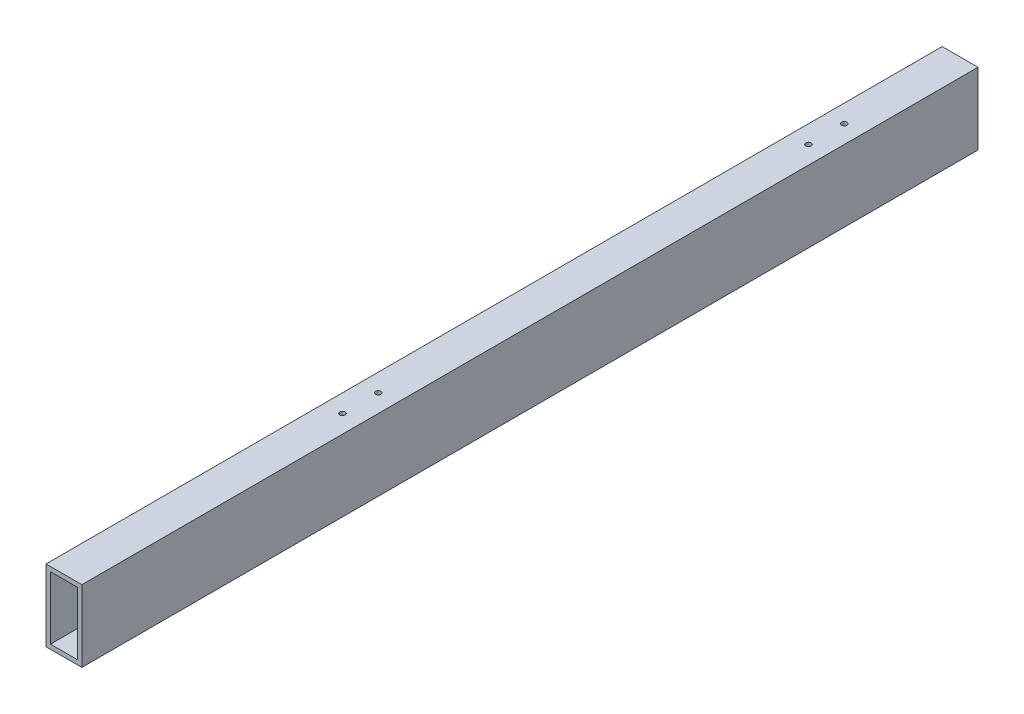
ISO-10303-21;
HEADER;
FILE_DESCRIPTION(('STEP AP214'),'2;1');
FILE_NAME('part.step','',(''),(''),'','','');
FILE_SCHEMA(('AUTOMOTIVE_DESIGN { 1 0 10303 214 1 1 1 1 }'));
ENDSEC;
DATA;
#1=APPLICATION_CONTEXT('core data for automotive mechanical design processes');
#2=APPLICATION_PROTOCOL_DEFINITION('international standard','automotive_design',2000,#1);
#3=PRODUCT_CONTEXT('',#1,'mechanical');
#4=PRODUCT('Part','Part','',(#3));
#5=PRODUCT_RELATED_PRODUCT_CATEGORY('part','',(#4));
#6=PRODUCT_DEFINITION_FORMATION('','',#4);
#7=PRODUCT_DEFINITION_CONTEXT('part definition',#1,'design');
#8=PRODUCT_DEFINITION('design','',#6,#7);
#9=PRODUCT_DEFINITION_SHAPE('','',#8);
#10=(LENGTH_UNIT() NAMED_UNIT(*) SI_UNIT(.MILLI.,.METRE.));
#11=(NAMED_UNIT(*) PLANE_ANGLE_UNIT() SI_UNIT($,.RADIAN.));
#12=(NAMED_UNIT(*) SI_UNIT($,.STERADIAN.) SOLID_ANGLE_UNIT());
#13=UNCERTAINTY_MEASURE_WITH_UNIT(LENGTH_MEASURE(1.E-05),#10,'distance_accuracy_value','');
#14=(GEOMETRIC_REPRESENTATION_CONTEXT(3) GLOBAL_UNCERTAINTY_ASSIGNED_CONTEXT((#13)) GLOBAL_UNIT_ASSIGNED_CONTEXT((#10,
#11,#12)) REPRESENTATION_CONTEXT('',''));
#15=CARTESIAN_POINT('',(0.,0.,0.));
#16=DIRECTION('',(0.,0.,1.));
#17=DIRECTION('',(1.,0.,0.));
#18=AXIS2_PLACEMENT_3D('',#15,#16,#17);
#19=CARTESIAN_POINT('',(0.,0.,317.5));
#20=DIRECTION('',(0.,0.,1.));
#21=DIRECTION('',(1.,0.,0.));
#22=AXIS2_PLACEMENT_3D('',#19,#20,#21);
#23=PLANE('',#22);
#24=DIRECTION('',(0.,1.,0.));
#25=VECTOR('',#24,1.);
#26=CARTESIAN_POINT('',(12.7,25.4,317.5));
#27=LINE('',#26,#25);
#28=CARTESIAN_POINT('',(12.7,-25.4,317.5));
#29=VERTEX_POINT('',#28);
#30=CARTESIAN_POINT('',(12.7,25.4,317.5));
#31=VERTEX_POINT('',#30);
#32=EDGE_CURVE('E139',#29,#31,#27,.T.);
#33=ORIENTED_EDGE('',*,*,#32,.T.);
#34=DIRECTION('',(-1.,0.,0.));
#35=VECTOR('',#34,1.);
#36=CARTESIAN_POINT('',(-12.7,25.4,317.5));
#37=LINE('',#36,#35);
#38=CARTESIAN_POINT('',(-12.7,25.4,317.5));
#39=VERTEX_POINT('',#38);
#40=EDGE_CURVE('E142',#31,#39,#37,.T.);
#41=ORIENTED_EDGE('',*,*,#40,.T.);
#42=DIRECTION('',(0.,-1.,0.));
#43=VECTOR('',#42,1.);
#44=CARTESIAN_POINT('',(-12.7,25.4,317.5));
#45=LINE('',#44,#43);
#46=CARTESIAN_POINT('',(-12.7,-25.4,317.5));
#47=VERTEX_POINT('',#46);
#48=EDGE_CURVE('E145',#39,#47,#45,.T.);
#49=ORIENTED_EDGE('',*,*,#48,.T.);
#50=DIRECTION('',(1.,0.,0.));
#51=VECTOR('',#50,1.);
#52=CARTESIAN_POINT('',(-12.7,-25.4,317.5));
#53=LINE('',#52,#51);
#54=EDGE_CURVE('E147',#47,#29,#53,.T.);
#55=ORIENTED_EDGE('',*,*,#54,.T.);
#56=EDGE_LOOP('',(#33,#41,#49,#55));
#57=FACE_BOUND('',#56,.T.);
#58=DIRECTION('',(1.,0.,0.));
#59=VECTOR('',#58,1.);
#60=CARTESIAN_POINT('',(-9.525,-22.225,317.5));
#61=LINE('',#60,#59);
#62=CARTESIAN_POINT('',(-9.525,-22.225,317.5));
#63=VERTEX_POINT('',#62);
#64=CARTESIAN_POINT('',(9.52500000000001,-22.225,317.5));
#65=VERTEX_POINT('',#64);
#66=EDGE_CURVE('E109',#63,#65,#61,.T.);
#67=ORIENTED_EDGE('',*,*,#66,.F.);
#68=DIRECTION('',(0.,-1.,0.));
#69=VECTOR('',#68,1.);
#70=CARTESIAN_POINT('',(-9.525,22.225,317.5));
#71=LINE('',#70,#69);
#72=CARTESIAN_POINT('',(-9.525,22.225,317.5));
#73=VERTEX_POINT('',#72);
#74=EDGE_CURVE('E101',#73,#63,#71,.T.);
#75=ORIENTED_EDGE('',*,*,#74,.F.);
#76=DIRECTION('',(-1.,0.,0.));
#77=VECTOR('',#76,1.);
#78=CARTESIAN_POINT('',(-9.525,22.225,317.5));
#79=LINE('',#78,#77);
#80=CARTESIAN_POINT('',(9.525,22.225,317.5));
#81=VERTEX_POINT('',#80);
#82=EDGE_CURVE('E123',#81,#73,#79,.T.);
#83=ORIENTED_EDGE('',*,*,#82,.F.);
#84=DIRECTION('',(0.,1.,0.));
#85=VECTOR('',#84,1.);
#86=CARTESIAN_POINT('',(9.525,22.225,317.5));
#87=LINE('',#86,#85);
#88=EDGE_CURVE('E121',#65,#81,#87,.T.);
#89=ORIENTED_EDGE('',*,*,#88,.F.);
#90=EDGE_LOOP('',(#67,#75,#83,#89));
#91=FACE_BOUND('',#90,.T.);
#92=ADVANCED_FACE('F34',(#57,#91),#23,.T.);
#93=CARTESIAN_POINT('',(0.,0.,-317.5));
#94=DIRECTION('',(0.,0.,1.));
#95=DIRECTION('',(1.,0.,0.));
#96=AXIS2_PLACEMENT_3D('',#93,#94,#95);
#97=PLANE('',#96);
#98=DIRECTION('',(0.,1.,0.));
#99=VECTOR('',#98,1.);
#100=CARTESIAN_POINT('',(12.7,25.4,-317.5));
#101=LINE('',#100,#99);
#102=CARTESIAN_POINT('',(12.7,-25.4,-317.5));
#103=VERTEX_POINT('',#102);
#104=CARTESIAN_POINT('',(12.7,25.4,-317.5));
#105=VERTEX_POINT('',#104);
#106=EDGE_CURVE('E117',#103,#105,#101,.T.);
#107=ORIENTED_EDGE('',*,*,#106,.F.);
#108=DIRECTION('',(1.,0.,0.));
#109=VECTOR('',#108,1.);
#110=CARTESIAN_POINT('',(-12.7,-25.4,-317.5));
#111=LINE('',#110,#109);
#112=CARTESIAN_POINT('',(-12.7,-25.4,-317.5));
#113=VERTEX_POINT('',#112);
#114=EDGE_CURVE('E143',#113,#103,#111,.T.);
#115=ORIENTED_EDGE('',*,*,#114,.F.);
#116=DIRECTION('',(0.,-1.,0.));
#117=VECTOR('',#116,1.);
#118=CARTESIAN_POINT('',(-12.7,25.4,-317.5));
#119=LINE('',#118,#117);
#120=CARTESIAN_POINT('',(-12.7,25.4,-317.5));
#121=VERTEX_POINT('',#120);
#122=EDGE_CURVE('E154',#121,#113,#119,.T.);
#123=ORIENTED_EDGE('',*,*,#122,.F.);
#124=DIRECTION('',(-1.,0.,0.));
#125=VECTOR('',#124,1.);
#126=CARTESIAN_POINT('',(-12.7,25.4,-317.5));
#127=LINE('',#126,#125);
#128=EDGE_CURVE('E152',#105,#121,#127,.T.);
#129=ORIENTED_EDGE('',*,*,#128,.F.);
#130=EDGE_LOOP('',(#107,#115,#123,#129));
#131=FACE_BOUND('',#130,.T.);
#132=DIRECTION('',(0.,-1.,0.));
#133=VECTOR('',#132,1.);
#134=CARTESIAN_POINT('',(-9.525,22.225,-317.5));
#135=LINE('',#134,#133);
#136=CARTESIAN_POINT('',(-9.525,22.225,-317.5));
#137=VERTEX_POINT('',#136);
#138=CARTESIAN_POINT('',(-9.525,-22.225,-317.5));
#139=VERTEX_POINT('',#138);
#140=EDGE_CURVE('E59',#137,#139,#135,.T.);
#141=ORIENTED_EDGE('',*,*,#140,.T.);
#142=DIRECTION('',(1.,0.,0.));
#143=VECTOR('',#142,1.);
#144=CARTESIAN_POINT('',(-9.525,-22.225,-317.5));
#145=LINE('',#144,#143);
#146=CARTESIAN_POINT('',(9.52500000000001,-22.225,-317.5));
#147=VERTEX_POINT('',#146);
#148=EDGE_CURVE('E116',#139,#147,#145,.T.);
#149=ORIENTED_EDGE('',*,*,#148,.T.);
#150=DIRECTION('',(0.,1.,0.));
#151=VECTOR('',#150,1.);
#152=CARTESIAN_POINT('',(9.525,22.225,-317.5));
#153=LINE('',#152,#151);
#154=CARTESIAN_POINT('',(9.525,22.225,-317.5));
#155=VERTEX_POINT('',#154);
#156=EDGE_CURVE('E131',#147,#155,#153,.T.);
#157=ORIENTED_EDGE('',*,*,#156,.T.);
#158=DIRECTION('',(-1.,0.,0.));
#159=VECTOR('',#158,1.);
#160=CARTESIAN_POINT('',(-9.525,22.225,-317.5));
#161=LINE('',#160,#159);
#162=EDGE_CURVE('E110',#155,#137,#161,.T.);
#163=ORIENTED_EDGE('',*,*,#162,.T.);
#164=EDGE_LOOP('',(#141,#149,#157,#163));
#165=FACE_BOUND('',#164,.T.);
#166=ADVANCED_FACE('F224',(#131,#165),#97,.F.);
#167=CARTESIAN_POINT('',(12.7,25.4,317.5));
#168=DIRECTION('',(-1.,0.,0.));
#169=DIRECTION('',(0.,-1.,0.));
#170=AXIS2_PLACEMENT_3D('',#167,#168,#169);
#171=PLANE('',#170);
#172=ORIENTED_EDGE('',*,*,#106,.T.);
#173=DIRECTION('',(0.,0.,-1.));
#174=VECTOR('',#173,1.);
#175=CARTESIAN_POINT('',(12.7,25.4,317.5));
#176=LINE('',#175,#174);
#177=EDGE_CURVE('E11',#31,#105,#176,.T.);
#178=ORIENTED_EDGE('',*,*,#177,.F.);
#179=ORIENTED_EDGE('',*,*,#32,.F.);
#180=DIRECTION('',(0.,0.,-1.));
#181=VECTOR('',#180,1.);
#182=CARTESIAN_POINT('',(12.7,-25.4,317.5));
#183=LINE('',#182,#181);
#184=EDGE_CURVE('E149',#29,#103,#183,.T.);
#185=ORIENTED_EDGE('',*,*,#184,.T.);
#186=EDGE_LOOP('',(#172,#178,#179,#185));
#187=FACE_BOUND('',#186,.T.);
#188=ADVANCED_FACE('F36',(#187),#171,.F.);
#189=CARTESIAN_POINT('',(-12.7,25.4,317.5));
#190=DIRECTION('',(0.,-1.,0.));
#191=DIRECTION('',(0.,0.,-1.));
#192=AXIS2_PLACEMENT_3D('',#189,#190,#191);
#193=PLANE('',#192);
#194=CARTESIAN_POINT('',(0.,25.4,-210.08594));
#195=DIRECTION('',(0.,1.,0.));
#196=DIRECTION('',(0.,0.,1.));
#197=AXIS2_PLACEMENT_3D('',#194,#195,#196);
#198=CIRCLE('',#197,1.905);
#199=CARTESIAN_POINT('',(0.,25.4,-208.18094));
#200=VERTEX_POINT('',#199);
#201=EDGE_CURVE('E249',#200,#200,#198,.T.);
#202=ORIENTED_EDGE('',*,*,#201,.F.);
#203=EDGE_LOOP('',(#202));
#204=FACE_BOUND('',#203,.T.);
#205=CARTESIAN_POINT('',(0.,25.4,-235.48594));
#206=DIRECTION('',(0.,1.,0.));
#207=DIRECTION('',(0.,0.,1.));
#208=AXIS2_PLACEMENT_3D('',#205,#206,#207);
#209=CIRCLE('',#208,1.905);
#210=CARTESIAN_POINT('',(0.,25.4,-233.58094));
#211=VERTEX_POINT('',#210);
#212=EDGE_CURVE('E182',#211,#211,#209,.T.);
#213=ORIENTED_EDGE('',*,*,#212,.F.);
#214=EDGE_LOOP('',(#213));
#215=FACE_BOUND('',#214,.T.);
#216=CARTESIAN_POINT('',(0.,25.4,94.7166));
#217=DIRECTION('',(0.,1.,0.));
#218=DIRECTION('',(0.,0.,1.));
#219=AXIS2_PLACEMENT_3D('',#216,#217,#218);
#220=CIRCLE('',#219,1.905);
#221=CARTESIAN_POINT('',(0.,25.4,96.6216));
#222=VERTEX_POINT('',#221);
#223=EDGE_CURVE('E179',#222,#222,#220,.T.);
#224=ORIENTED_EDGE('',*,*,#223,.F.);
#225=EDGE_LOOP('',(#224));
#226=FACE_BOUND('',#225,.T.);
#227=CARTESIAN_POINT('',(0.,25.4,120.1166));
#228=DIRECTION('',(0.,1.,0.));
#229=DIRECTION('',(0.,0.,1.));
#230=AXIS2_PLACEMENT_3D('',#227,#228,#229);
#231=CIRCLE('',#230,1.905);
#232=CARTESIAN_POINT('',(0.,25.4,122.0216));
#233=VERTEX_POINT('',#232);
#234=EDGE_CURVE('E198',#233,#233,#231,.T.);
#235=ORIENTED_EDGE('',*,*,#234,.F.);
#236=EDGE_LOOP('',(#235));
#237=FACE_BOUND('',#236,.T.);
#238=ORIENTED_EDGE('',*,*,#128,.T.);
#239=DIRECTION('',(0.,0.,-1.));
#240=VECTOR('',#239,1.);
#241=CARTESIAN_POINT('',(-12.7,25.4,317.5));
#242=LINE('',#241,#240);
#243=EDGE_CURVE('E43',#39,#121,#242,.T.);
#244=ORIENTED_EDGE('',*,*,#243,.F.);
#245=ORIENTED_EDGE('',*,*,#40,.F.);
#246=ORIENTED_EDGE('',*,*,#177,.T.);
#247=EDGE_LOOP('',(#238,#244,#245,#246));
#248=FACE_BOUND('',#247,.T.);
#249=ADVANCED_FACE('F238',(#204,#215,#226,#237,#248),#193,.F.);
#250=CARTESIAN_POINT('',(-12.7,25.4,317.5));
#251=DIRECTION('',(1.,0.,0.));
#252=DIRECTION('',(0.,1.,0.));
#253=AXIS2_PLACEMENT_3D('',#250,#251,#252);
#254=PLANE('',#253);
#255=ORIENTED_EDGE('',*,*,#122,.T.);
#256=DIRECTION('',(0.,0.,-1.));
#257=VECTOR('',#256,1.);
#258=CARTESIAN_POINT('',(-12.7,-25.4,317.5));
#259=LINE('',#258,#257);
#260=EDGE_CURVE('E159',#47,#113,#259,.T.);
#261=ORIENTED_EDGE('',*,*,#260,.F.);
#262=ORIENTED_EDGE('',*,*,#48,.F.);
#263=ORIENTED_EDGE('',*,*,#243,.T.);
#264=EDGE_LOOP('',(#255,#261,#262,#263));
#265=FACE_BOUND('',#264,.T.);
#266=ADVANCED_FACE('F235',(#265),#254,.F.);
#267=CARTESIAN_POINT('',(-12.7,-25.4,317.5));
#268=DIRECTION('',(0.,1.,0.));
#269=DIRECTION('',(0.,0.,1.));
#270=AXIS2_PLACEMENT_3D('',#267,#268,#269);
#271=PLANE('',#270);
#272=CARTESIAN_POINT('',(0.,-25.4,-210.08594));
#273=DIRECTION('',(0.,1.,0.));
#274=DIRECTION('',(0.,0.,1.));
#275=AXIS2_PLACEMENT_3D('',#272,#273,#274);
#276=CIRCLE('',#275,1.905);
#277=CARTESIAN_POINT('',(0.,-25.4,-208.18094));
#278=VERTEX_POINT('',#277);
#279=EDGE_CURVE('E302',#278,#278,#276,.T.);
#280=ORIENTED_EDGE('',*,*,#279,.T.);
#281=EDGE_LOOP('',(#280));
#282=FACE_BOUND('',#281,.T.);
#283=CARTESIAN_POINT('',(0.,-25.4,-235.48594));
#284=DIRECTION('',(0.,1.,0.));
#285=DIRECTION('',(0.,0.,1.));
#286=AXIS2_PLACEMENT_3D('',#283,#284,#285);
#287=CIRCLE('',#286,1.905);
#288=CARTESIAN_POINT('',(0.,-25.4,-233.58094));
#289=VERTEX_POINT('',#288);
#290=EDGE_CURVE('E175',#289,#289,#287,.T.);
#291=ORIENTED_EDGE('',*,*,#290,.T.);
#292=EDGE_LOOP('',(#291));
#293=FACE_BOUND('',#292,.T.);
#294=CARTESIAN_POINT('',(0.,-25.4,94.7166));
#295=DIRECTION('',(0.,1.,0.));
#296=DIRECTION('',(0.,0.,1.));
#297=AXIS2_PLACEMENT_3D('',#294,#295,#296);
#298=CIRCLE('',#297,1.905);
#299=CARTESIAN_POINT('',(0.,-25.4,96.6216));
#300=VERTEX_POINT('',#299);
#301=EDGE_CURVE('E171',#300,#300,#298,.T.);
#302=ORIENTED_EDGE('',*,*,#301,.T.);
#303=EDGE_LOOP('',(#302));
#304=FACE_BOUND('',#303,.T.);
#305=CARTESIAN_POINT('',(0.,-25.4,120.1166));
#306=DIRECTION('',(0.,1.,0.));
#307=DIRECTION('',(0.,0.,1.));
#308=AXIS2_PLACEMENT_3D('',#305,#306,#307);
#309=CIRCLE('',#308,1.905);
#310=CARTESIAN_POINT('',(0.,-25.4,122.0216));
#311=VERTEX_POINT('',#310);
#312=EDGE_CURVE('E167',#311,#311,#309,.T.);
#313=ORIENTED_EDGE('',*,*,#312,.T.);
#314=EDGE_LOOP('',(#313));
#315=FACE_BOUND('',#314,.T.);
#316=ORIENTED_EDGE('',*,*,#114,.T.);
#317=ORIENTED_EDGE('',*,*,#184,.F.);
#318=ORIENTED_EDGE('',*,*,#54,.F.);
#319=ORIENTED_EDGE('',*,*,#260,.T.);
#320=EDGE_LOOP('',(#316,#317,#318,#319));
#321=FACE_BOUND('',#320,.T.);
#322=ADVANCED_FACE('F219',(#282,#293,#304,#315,#321),#271,.F.);
#323=CARTESIAN_POINT('',(-9.525,22.225,317.5));
#324=DIRECTION('',(1.,0.,0.));
#325=DIRECTION('',(0.,1.,0.));
#326=AXIS2_PLACEMENT_3D('',#323,#324,#325);
#327=PLANE('',#326);
#328=ORIENTED_EDGE('',*,*,#140,.F.);
#329=DIRECTION('',(0.,0.,-1.));
#330=VECTOR('',#329,1.);
#331=CARTESIAN_POINT('',(-9.525,22.225,317.5));
#332=LINE('',#331,#330);
#333=EDGE_CURVE('E105',#73,#137,#332,.T.);
#334=ORIENTED_EDGE('',*,*,#333,.F.);
#335=ORIENTED_EDGE('',*,*,#74,.T.);
#336=DIRECTION('',(0.,0.,-1.));
#337=VECTOR('',#336,1.);
#338=CARTESIAN_POINT('',(-9.525,-22.225,317.5));
#339=LINE('',#338,#337);
#340=EDGE_CURVE('E104',#63,#139,#339,.T.);
#341=ORIENTED_EDGE('',*,*,#340,.T.);
#342=EDGE_LOOP('',(#328,#334,#335,#341));
#343=FACE_BOUND('',#342,.T.);
#344=ADVANCED_FACE('F103',(#343),#327,.T.);
#345=CARTESIAN_POINT('',(-9.525,-22.225,317.5));
#346=DIRECTION('',(0.,1.,0.));
#347=DIRECTION('',(-1.,0.,0.));
#348=AXIS2_PLACEMENT_3D('',#345,#346,#347);
#349=PLANE('',#348);
#350=CARTESIAN_POINT('',(0.,-22.225,-210.08594));
#351=DIRECTION('',(0.,1.,0.));
#352=DIRECTION('',(-1.,0.,0.));
#353=AXIS2_PLACEMENT_3D('',#350,#351,#352);
#354=CIRCLE('',#353,1.905);
#355=CARTESIAN_POINT('',(-1.905,-22.225,-210.08594));
#356=VERTEX_POINT('',#355);
#357=EDGE_CURVE('E187',#356,#356,#354,.T.);
#358=ORIENTED_EDGE('',*,*,#357,.F.);
#359=EDGE_LOOP('',(#358));
#360=FACE_BOUND('',#359,.T.);
#361=CARTESIAN_POINT('',(0.,-22.225,-235.48594));
#362=DIRECTION('',(0.,1.,0.));
#363=DIRECTION('',(-1.,0.,0.));
#364=AXIS2_PLACEMENT_3D('',#361,#362,#363);
#365=CIRCLE('',#364,1.905);
#366=CARTESIAN_POINT('',(-1.905,-22.225,-235.48594));
#367=VERTEX_POINT('',#366);
#368=EDGE_CURVE('E174',#367,#367,#365,.T.);
#369=ORIENTED_EDGE('',*,*,#368,.F.);
#370=EDGE_LOOP('',(#369));
#371=FACE_BOUND('',#370,.T.);
#372=CARTESIAN_POINT('',(0.,-22.225,94.7166));
#373=DIRECTION('',(0.,1.,0.));
#374=DIRECTION('',(-1.,0.,0.));
#375=AXIS2_PLACEMENT_3D('',#372,#373,#374);
#376=CIRCLE('',#375,1.905);
#377=CARTESIAN_POINT('',(-1.905,-22.225,94.7166));
#378=VERTEX_POINT('',#377);
#379=EDGE_CURVE('E170',#378,#378,#376,.T.);
#380=ORIENTED_EDGE('',*,*,#379,.F.);
#381=EDGE_LOOP('',(#380));
#382=FACE_BOUND('',#381,.T.);
#383=CARTESIAN_POINT('',(0.,-22.225,120.1166));
#384=DIRECTION('',(0.,1.,0.));
#385=DIRECTION('',(-1.,0.,0.));
#386=AXIS2_PLACEMENT_3D('',#383,#384,#385);
#387=CIRCLE('',#386,1.905);
#388=CARTESIAN_POINT('',(-1.905,-22.225,120.1166));
#389=VERTEX_POINT('',#388);
#390=EDGE_CURVE('E129',#389,#389,#387,.T.);
#391=ORIENTED_EDGE('',*,*,#390,.F.);
#392=EDGE_LOOP('',(#391));
#393=FACE_BOUND('',#392,.T.);
#394=ORIENTED_EDGE('',*,*,#148,.F.);
#395=ORIENTED_EDGE('',*,*,#340,.F.);
#396=ORIENTED_EDGE('',*,*,#66,.T.);
#397=DIRECTION('',(0.,0.,-1.));
#398=VECTOR('',#397,1.);
#399=CARTESIAN_POINT('',(9.52500000000001,-22.225,317.5));
#400=LINE('',#399,#398);
#401=EDGE_CURVE('E118',#65,#147,#400,.T.);
#402=ORIENTED_EDGE('',*,*,#401,.T.);
#403=EDGE_LOOP('',(#394,#395,#396,#402));
#404=FACE_BOUND('',#403,.T.);
#405=ADVANCED_FACE('F113',(#360,#371,#382,#393,#404),#349,.T.);
#406=CARTESIAN_POINT('',(9.525,22.225,317.5));
#407=DIRECTION('',(-1.,0.,0.));
#408=DIRECTION('',(0.,-1.,0.));
#409=AXIS2_PLACEMENT_3D('',#406,#407,#408);
#410=PLANE('',#409);
#411=ORIENTED_EDGE('',*,*,#156,.F.);
#412=ORIENTED_EDGE('',*,*,#401,.F.);
#413=ORIENTED_EDGE('',*,*,#88,.T.);
#414=DIRECTION('',(0.,0.,-1.));
#415=VECTOR('',#414,1.);
#416=CARTESIAN_POINT('',(9.525,22.225,317.5));
#417=LINE('',#416,#415);
#418=EDGE_CURVE('E51',#81,#155,#417,.T.);
#419=ORIENTED_EDGE('',*,*,#418,.T.);
#420=EDGE_LOOP('',(#411,#412,#413,#419));
#421=FACE_BOUND('',#420,.T.);
#422=ADVANCED_FACE('F209',(#421),#410,.T.);
#423=CARTESIAN_POINT('',(-9.525,22.225,317.5));
#424=DIRECTION('',(0.,-1.,0.));
#425=DIRECTION('',(0.,0.,-1.));
#426=AXIS2_PLACEMENT_3D('',#423,#424,#425);
#427=PLANE('',#426);
#428=CARTESIAN_POINT('',(0.,22.225,-210.08594));
#429=DIRECTION('',(0.,-1.,0.));
#430=DIRECTION('',(0.,0.,-1.));
#431=AXIS2_PLACEMENT_3D('',#428,#429,#430);
#432=CIRCLE('',#431,1.905);
#433=CARTESIAN_POINT('',(0.,22.225,-211.99094));
#434=VERTEX_POINT('',#433);
#435=EDGE_CURVE('E38',#434,#434,#432,.T.);
#436=ORIENTED_EDGE('',*,*,#435,.F.);
#437=EDGE_LOOP('',(#436));
#438=FACE_BOUND('',#437,.T.);
#439=CARTESIAN_POINT('',(0.,22.225,-235.48594));
#440=DIRECTION('',(0.,-1.,0.));
#441=DIRECTION('',(0.,0.,-1.));
#442=AXIS2_PLACEMENT_3D('',#439,#440,#441);
#443=CIRCLE('',#442,1.905);
#444=CARTESIAN_POINT('',(0.,22.225,-237.39094));
#445=VERTEX_POINT('',#444);
#446=EDGE_CURVE('E172',#445,#445,#443,.T.);
#447=ORIENTED_EDGE('',*,*,#446,.F.);
#448=EDGE_LOOP('',(#447));
#449=FACE_BOUND('',#448,.T.);
#450=CARTESIAN_POINT('',(0.,22.225,94.7166));
#451=DIRECTION('',(0.,-1.,0.));
#452=DIRECTION('',(0.,0.,-1.));
#453=AXIS2_PLACEMENT_3D('',#450,#451,#452);
#454=CIRCLE('',#453,1.905);
#455=CARTESIAN_POINT('',(0.,22.225,92.8116));
#456=VERTEX_POINT('',#455);
#457=EDGE_CURVE('E168',#456,#456,#454,.T.);
#458=ORIENTED_EDGE('',*,*,#457,.F.);
#459=EDGE_LOOP('',(#458));
#460=FACE_BOUND('',#459,.T.);
#461=CARTESIAN_POINT('',(0.,22.225,120.1166));
#462=DIRECTION('',(0.,-1.,0.));
#463=DIRECTION('',(0.,0.,-1.));
#464=AXIS2_PLACEMENT_3D('',#461,#462,#463);
#465=CIRCLE('',#464,1.905);
#466=CARTESIAN_POINT('',(0.,22.225,118.2116));
#467=VERTEX_POINT('',#466);
#468=EDGE_CURVE('E164',#467,#467,#465,.T.);
#469=ORIENTED_EDGE('',*,*,#468,.F.);
#470=EDGE_LOOP('',(#469));
#471=FACE_BOUND('',#470,.T.);
#472=ORIENTED_EDGE('',*,*,#162,.F.);
#473=ORIENTED_EDGE('',*,*,#418,.F.);
#474=ORIENTED_EDGE('',*,*,#82,.T.);
#475=ORIENTED_EDGE('',*,*,#333,.T.);
#476=EDGE_LOOP('',(#472,#473,#474,#475));
#477=FACE_BOUND('',#476,.T.);
#478=ADVANCED_FACE('F216',(#438,#449,#460,#471,#477),#427,.T.);
#479=CARTESIAN_POINT('',(0.,-25.4,120.1166));
#480=DIRECTION('',(0.,1.,0.));
#481=DIRECTION('',(0.,0.,1.));
#482=AXIS2_PLACEMENT_3D('',#479,#480,#481);
#483=CYLINDRICAL_SURFACE('',#482,1.905);
#484=ORIENTED_EDGE('',*,*,#468,.T.);
#485=EDGE_LOOP('',(#484));
#486=FACE_BOUND('',#485,.T.);
#487=ORIENTED_EDGE('',*,*,#234,.T.);
#488=EDGE_LOOP('',(#487));
#489=FACE_BOUND('',#488,.T.);
#490=ADVANCED_FACE('F270',(#486,#489),#483,.F.);
#491=ORIENTED_EDGE('',*,*,#390,.T.);
#492=EDGE_LOOP('',(#491));
#493=FACE_BOUND('',#492,.T.);
#494=ORIENTED_EDGE('',*,*,#312,.F.);
#495=EDGE_LOOP('',(#494));
#496=FACE_BOUND('',#495,.T.);
#497=ADVANCED_FACE('F205',(#493,#496),#483,.F.);
#498=CARTESIAN_POINT('',(0.,-25.4,94.7166));
#499=DIRECTION('',(0.,1.,0.));
#500=DIRECTION('',(0.,0.,1.));
#501=AXIS2_PLACEMENT_3D('',#498,#499,#500);
#502=CYLINDRICAL_SURFACE('',#501,1.905);
#503=ORIENTED_EDGE('',*,*,#457,.T.);
#504=EDGE_LOOP('',(#503));
#505=FACE_BOUND('',#504,.T.);
#506=ORIENTED_EDGE('',*,*,#223,.T.);
#507=EDGE_LOOP('',(#506));
#508=FACE_BOUND('',#507,.T.);
#509=ADVANCED_FACE('F281',(#505,#508),#502,.F.);
#510=ORIENTED_EDGE('',*,*,#379,.T.);
#511=EDGE_LOOP('',(#510));
#512=FACE_BOUND('',#511,.T.);
#513=ORIENTED_EDGE('',*,*,#301,.F.);
#514=EDGE_LOOP('',(#513));
#515=FACE_BOUND('',#514,.T.);
#516=ADVANCED_FACE('F284',(#512,#515),#502,.F.);
#517=CARTESIAN_POINT('',(0.,-25.4,-235.48594));
#518=DIRECTION('',(0.,1.,0.));
#519=DIRECTION('',(0.,0.,1.));
#520=AXIS2_PLACEMENT_3D('',#517,#518,#519);
#521=CYLINDRICAL_SURFACE('',#520,1.905);
#522=ORIENTED_EDGE('',*,*,#446,.T.);
#523=EDGE_LOOP('',(#522));
#524=FACE_BOUND('',#523,.T.);
#525=ORIENTED_EDGE('',*,*,#212,.T.);
#526=EDGE_LOOP('',(#525));
#527=FACE_BOUND('',#526,.T.);
#528=ADVANCED_FACE('F286',(#524,#527),#521,.F.);
#529=ORIENTED_EDGE('',*,*,#368,.T.);
#530=EDGE_LOOP('',(#529));
#531=FACE_BOUND('',#530,.T.);
#532=ORIENTED_EDGE('',*,*,#290,.F.);
#533=EDGE_LOOP('',(#532));
#534=FACE_BOUND('',#533,.T.);
#535=ADVANCED_FACE('F289',(#531,#534),#521,.F.);
#536=CARTESIAN_POINT('',(0.,-25.4,-210.08594));
#537=DIRECTION('',(0.,1.,0.));
#538=DIRECTION('',(0.,0.,1.));
#539=AXIS2_PLACEMENT_3D('',#536,#537,#538);
#540=CYLINDRICAL_SURFACE('',#539,1.905);
#541=ORIENTED_EDGE('',*,*,#435,.T.);
#542=EDGE_LOOP('',(#541));
#543=FACE_BOUND('',#542,.T.);
#544=ORIENTED_EDGE('',*,*,#201,.T.);
#545=EDGE_LOOP('',(#544));
#546=FACE_BOUND('',#545,.T.);
#547=ADVANCED_FACE('F290',(#543,#546),#540,.F.);
#548=ORIENTED_EDGE('',*,*,#357,.T.);
#549=EDGE_LOOP('',(#548));
#550=FACE_BOUND('',#549,.T.);
#551=ORIENTED_EDGE('',*,*,#279,.F.);
#552=EDGE_LOOP('',(#551));
#553=FACE_BOUND('',#552,.T.);
#554=ADVANCED_FACE('F292',(#550,#553),#540,.F.);
#555=CLOSED_SHELL('',(#92,#166,#188,#249,#266,#322,#344,#405,#422,#478,#490,#497,#509,#516,#528,
#535,#547,#554));
#556=MANIFOLD_SOLID_BREP('B2',#555);
#557=ADVANCED_BREP_SHAPE_REPRESENTATION('',(#18,#556),#14);
#558=SHAPE_DEFINITION_REPRESENTATION(#9,#557);
ENDSEC;
END-ISO-10303-21;
